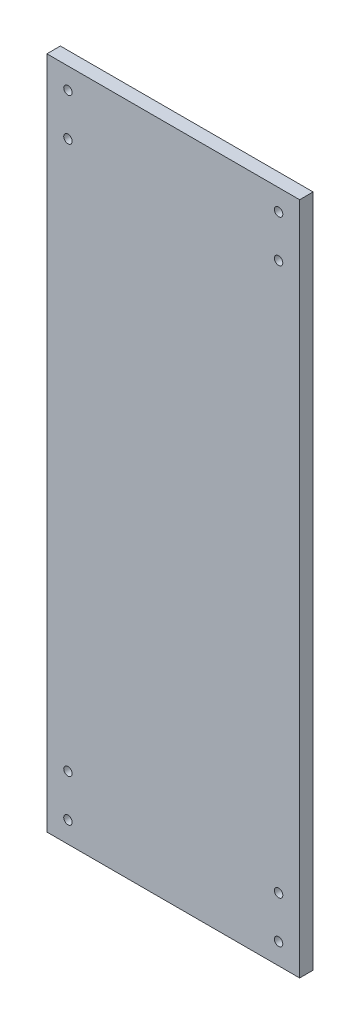
ISO-10303-21;
HEADER;
FILE_DESCRIPTION(('STEP AP214'),'2;1');
FILE_NAME('part.step','',(''),(''),'','','');
FILE_SCHEMA(('AUTOMOTIVE_DESIGN { 1 0 10303 214 1 1 1 1 }'));
ENDSEC;
DATA;
#1=APPLICATION_CONTEXT('core data for automotive mechanical design processes');
#2=APPLICATION_PROTOCOL_DEFINITION('international standard','automotive_design',2000,#1);
#3=PRODUCT_CONTEXT('',#1,'mechanical');
#4=PRODUCT('Part','Part','',(#3));
#5=PRODUCT_RELATED_PRODUCT_CATEGORY('part','',(#4));
#6=PRODUCT_DEFINITION_FORMATION('','',#4);
#7=PRODUCT_DEFINITION_CONTEXT('part definition',#1,'design');
#8=PRODUCT_DEFINITION('design','',#6,#7);
#9=PRODUCT_DEFINITION_SHAPE('','',#8);
#10=(LENGTH_UNIT() NAMED_UNIT(*) SI_UNIT(.MILLI.,.METRE.));
#11=(NAMED_UNIT(*) PLANE_ANGLE_UNIT() SI_UNIT($,.RADIAN.));
#12=(NAMED_UNIT(*) SI_UNIT($,.STERADIAN.) SOLID_ANGLE_UNIT());
#13=UNCERTAINTY_MEASURE_WITH_UNIT(LENGTH_MEASURE(1.E-05),#10,'distance_accuracy_value','');
#14=(GEOMETRIC_REPRESENTATION_CONTEXT(3) GLOBAL_UNCERTAINTY_ASSIGNED_CONTEXT((#13)) GLOBAL_UNIT_ASSIGNED_CONTEXT((#10,
#11,#12)) REPRESENTATION_CONTEXT('',''));
#15=CARTESIAN_POINT('',(0.,0.,0.));
#16=DIRECTION('',(0.,0.,1.));
#17=DIRECTION('',(1.,0.,0.));
#18=AXIS2_PLACEMENT_3D('',#15,#16,#17);
#19=CARTESIAN_POINT('',(0.,0.,1.6));
#20=DIRECTION('',(0.,0.,-1.));
#21=DIRECTION('',(-1.,0.,0.));
#22=AXIS2_PLACEMENT_3D('',#19,#20,#21);
#23=PLANE('',#22);
#24=DIRECTION('',(0.,1.,0.));
#25=VECTOR('',#24,1.);
#26=CARTESIAN_POINT('',(142.096158615373,78.9999996110874,1.6));
#27=LINE('',#26,#25);
#28=CARTESIAN_POINT('',(142.096158615373,-1.00000038891262,1.6));
#29=VERTEX_POINT('',#28);
#30=CARTESIAN_POINT('',(142.096158615373,78.9999996110874,1.6));
#31=VERTEX_POINT('',#30);
#32=EDGE_CURVE('E86',#29,#31,#27,.T.);
#33=ORIENTED_EDGE('',*,*,#32,.T.);
#34=DIRECTION('',(-1.,0.,0.));
#35=VECTOR('',#34,1.);
#36=CARTESIAN_POINT('',(112.096158615373,78.9999996110874,1.6));
#37=LINE('',#36,#35);
#38=CARTESIAN_POINT('',(112.096158615373,78.9999996110874,1.6));
#39=VERTEX_POINT('',#38);
#40=EDGE_CURVE('E81',#31,#39,#37,.T.);
#41=ORIENTED_EDGE('',*,*,#40,.T.);
#42=DIRECTION('',(0.,-1.,0.));
#43=VECTOR('',#42,1.);
#44=CARTESIAN_POINT('',(112.096158615373,-1.00000038891261,1.6));
#45=LINE('',#44,#43);
#46=CARTESIAN_POINT('',(112.096158615373,-1.00000038891261,1.6));
#47=VERTEX_POINT('',#46);
#48=EDGE_CURVE('E84',#39,#47,#45,.T.);
#49=ORIENTED_EDGE('',*,*,#48,.T.);
#50=DIRECTION('',(1.,0.,0.));
#51=VECTOR('',#50,1.);
#52=CARTESIAN_POINT('',(142.096158615373,-1.00000038891262,1.6));
#53=LINE('',#52,#51);
#54=EDGE_CURVE('E51',#47,#29,#53,.T.);
#55=ORIENTED_EDGE('',*,*,#54,.T.);
#56=EDGE_LOOP('',(#33,#41,#49,#55));
#57=FACE_BOUND('',#56,.T.);
#58=CARTESIAN_POINT('',(114.596158615373,6.49999961108738,1.6));
#59=DIRECTION('',(0.,0.,1.));
#60=DIRECTION('',(1.,0.,0.));
#61=AXIS2_PLACEMENT_3D('',#58,#59,#60);
#62=CIRCLE('',#61,0.5);
#63=CARTESIAN_POINT('',(115.096158615373,6.49999961108738,1.6));
#64=VERTEX_POINT('',#63);
#65=EDGE_CURVE('E101',#64,#64,#62,.T.);
#66=ORIENTED_EDGE('',*,*,#65,.F.);
#67=EDGE_LOOP('',(#66));
#68=FACE_BOUND('',#67,.T.);
#69=CARTESIAN_POINT('',(114.596158615373,71.4999996110874,1.6));
#70=DIRECTION('',(0.,0.,1.));
#71=DIRECTION('',(1.,0.,0.));
#72=AXIS2_PLACEMENT_3D('',#69,#70,#71);
#73=CIRCLE('',#72,0.5);
#74=CARTESIAN_POINT('',(115.096158615373,71.4999996110874,1.6));
#75=VERTEX_POINT('',#74);
#76=EDGE_CURVE('E116',#75,#75,#73,.T.);
#77=ORIENTED_EDGE('',*,*,#76,.F.);
#78=EDGE_LOOP('',(#77));
#79=FACE_BOUND('',#78,.T.);
#80=CARTESIAN_POINT('',(139.596158615373,6.49999961108738,1.6));
#81=DIRECTION('',(0.,0.,1.));
#82=DIRECTION('',(1.,0.,0.));
#83=AXIS2_PLACEMENT_3D('',#80,#81,#82);
#84=CIRCLE('',#83,0.5);
#85=CARTESIAN_POINT('',(140.096158615373,6.49999961108738,1.6));
#86=VERTEX_POINT('',#85);
#87=EDGE_CURVE('E122',#86,#86,#84,.T.);
#88=ORIENTED_EDGE('',*,*,#87,.F.);
#89=EDGE_LOOP('',(#88));
#90=FACE_BOUND('',#89,.T.);
#91=CARTESIAN_POINT('',(139.596158615373,71.4999996110874,1.6));
#92=DIRECTION('',(0.,0.,1.));
#93=DIRECTION('',(1.,0.,0.));
#94=AXIS2_PLACEMENT_3D('',#91,#92,#93);
#95=CIRCLE('',#94,0.5);
#96=CARTESIAN_POINT('',(140.096158615373,71.4999996110874,1.6));
#97=VERTEX_POINT('',#96);
#98=EDGE_CURVE('E128',#97,#97,#95,.T.);
#99=ORIENTED_EDGE('',*,*,#98,.F.);
#100=EDGE_LOOP('',(#99));
#101=FACE_BOUND('',#100,.T.);
#102=CARTESIAN_POINT('',(114.596158615373,76.4999996110874,1.6));
#103=DIRECTION('',(0.,0.,1.));
#104=DIRECTION('',(1.,0.,0.));
#105=AXIS2_PLACEMENT_3D('',#102,#103,#104);
#106=CIRCLE('',#105,0.5);
#107=CARTESIAN_POINT('',(115.096158615373,76.4999996110874,1.6));
#108=VERTEX_POINT('',#107);
#109=EDGE_CURVE('E134',#108,#108,#106,.T.);
#110=ORIENTED_EDGE('',*,*,#109,.F.);
#111=EDGE_LOOP('',(#110));
#112=FACE_BOUND('',#111,.T.);
#113=CARTESIAN_POINT('',(139.596158615373,76.4999996110874,1.6));
#114=DIRECTION('',(0.,0.,1.));
#115=DIRECTION('',(1.,0.,0.));
#116=AXIS2_PLACEMENT_3D('',#113,#114,#115);
#117=CIRCLE('',#116,0.5);
#118=CARTESIAN_POINT('',(140.096158615373,76.4999996110874,1.6));
#119=VERTEX_POINT('',#118);
#120=EDGE_CURVE('E140',#119,#119,#117,.T.);
#121=ORIENTED_EDGE('',*,*,#120,.F.);
#122=EDGE_LOOP('',(#121));
#123=FACE_BOUND('',#122,.T.);
#124=CARTESIAN_POINT('',(114.596158615373,1.49999961108738,1.6));
#125=DIRECTION('',(0.,0.,1.));
#126=DIRECTION('',(1.,0.,0.));
#127=AXIS2_PLACEMENT_3D('',#124,#125,#126);
#128=CIRCLE('',#127,0.5);
#129=CARTESIAN_POINT('',(115.096158615373,1.49999961108738,1.6));
#130=VERTEX_POINT('',#129);
#131=EDGE_CURVE('E146',#130,#130,#128,.T.);
#132=ORIENTED_EDGE('',*,*,#131,.F.);
#133=EDGE_LOOP('',(#132));
#134=FACE_BOUND('',#133,.T.);
#135=CARTESIAN_POINT('',(139.596158615373,1.49999961108738,1.6));
#136=DIRECTION('',(0.,0.,1.));
#137=DIRECTION('',(1.,0.,0.));
#138=AXIS2_PLACEMENT_3D('',#135,#136,#137);
#139=CIRCLE('',#138,0.5);
#140=CARTESIAN_POINT('',(140.096158615373,1.49999961108738,1.6));
#141=VERTEX_POINT('',#140);
#142=EDGE_CURVE('E152',#141,#141,#139,.T.);
#143=ORIENTED_EDGE('',*,*,#142,.F.);
#144=EDGE_LOOP('',(#143));
#145=FACE_BOUND('',#144,.T.);
#146=ADVANCED_FACE('F34',(#57,#68,#79,#90,#101,#112,#123,#134,#145),#23,.F.);
#147=CARTESIAN_POINT('',(0.,0.,0.));
#148=DIRECTION('',(0.,0.,-1.));
#149=DIRECTION('',(-1.,0.,0.));
#150=AXIS2_PLACEMENT_3D('',#147,#148,#149);
#151=PLANE('',#150);
#152=CARTESIAN_POINT('',(114.596158615373,1.49999961108738,0.));
#153=DIRECTION('',(0.,0.,1.));
#154=DIRECTION('',(1.,0.,0.));
#155=AXIS2_PLACEMENT_3D('',#152,#153,#154);
#156=CIRCLE('',#155,0.5);
#157=CARTESIAN_POINT('',(115.096158615373,1.49999961108738,0.));
#158=VERTEX_POINT('',#157);
#159=EDGE_CURVE('E149',#158,#158,#156,.T.);
#160=ORIENTED_EDGE('',*,*,#159,.T.);
#161=EDGE_LOOP('',(#160));
#162=FACE_BOUND('',#161,.T.);
#163=CARTESIAN_POINT('',(114.596158615373,76.4999996110874,0.));
#164=DIRECTION('',(0.,0.,1.));
#165=DIRECTION('',(1.,0.,0.));
#166=AXIS2_PLACEMENT_3D('',#163,#164,#165);
#167=CIRCLE('',#166,0.5);
#168=CARTESIAN_POINT('',(115.096158615373,76.4999996110874,0.));
#169=VERTEX_POINT('',#168);
#170=EDGE_CURVE('E137',#169,#169,#167,.T.);
#171=ORIENTED_EDGE('',*,*,#170,.T.);
#172=EDGE_LOOP('',(#171));
#173=FACE_BOUND('',#172,.T.);
#174=CARTESIAN_POINT('',(139.596158615373,6.49999961108738,0.));
#175=DIRECTION('',(0.,0.,1.));
#176=DIRECTION('',(1.,0.,0.));
#177=AXIS2_PLACEMENT_3D('',#174,#175,#176);
#178=CIRCLE('',#177,0.5);
#179=CARTESIAN_POINT('',(140.096158615373,6.49999961108738,0.));
#180=VERTEX_POINT('',#179);
#181=EDGE_CURVE('E125',#180,#180,#178,.T.);
#182=ORIENTED_EDGE('',*,*,#181,.T.);
#183=EDGE_LOOP('',(#182));
#184=FACE_BOUND('',#183,.T.);
#185=CARTESIAN_POINT('',(114.596158615373,6.49999961108738,0.));
#186=DIRECTION('',(0.,0.,1.));
#187=DIRECTION('',(1.,0.,0.));
#188=AXIS2_PLACEMENT_3D('',#185,#186,#187);
#189=CIRCLE('',#188,0.5);
#190=CARTESIAN_POINT('',(115.096158615373,6.49999961108738,0.));
#191=VERTEX_POINT('',#190);
#192=EDGE_CURVE('E113',#191,#191,#189,.T.);
#193=ORIENTED_EDGE('',*,*,#192,.T.);
#194=EDGE_LOOP('',(#193));
#195=FACE_BOUND('',#194,.T.);
#196=DIRECTION('',(0.,1.,0.));
#197=VECTOR('',#196,1.);
#198=CARTESIAN_POINT('',(142.096158615373,78.9999996110874,0.));
#199=LINE('',#198,#197);
#200=CARTESIAN_POINT('',(142.096158615373,-1.00000038891262,0.));
#201=VERTEX_POINT('',#200);
#202=CARTESIAN_POINT('',(142.096158615373,78.9999996110874,0.));
#203=VERTEX_POINT('',#202);
#204=EDGE_CURVE('E98',#201,#203,#199,.T.);
#205=ORIENTED_EDGE('',*,*,#204,.F.);
#206=DIRECTION('',(1.,0.,0.));
#207=VECTOR('',#206,1.);
#208=CARTESIAN_POINT('',(142.096158615373,-1.00000038891262,0.));
#209=LINE('',#208,#207);
#210=CARTESIAN_POINT('',(112.096158615373,-1.00000038891261,0.));
#211=VERTEX_POINT('',#210);
#212=EDGE_CURVE('E74',#211,#201,#209,.T.);
#213=ORIENTED_EDGE('',*,*,#212,.F.);
#214=DIRECTION('',(0.,-1.,0.));
#215=VECTOR('',#214,1.);
#216=CARTESIAN_POINT('',(112.096158615373,-1.00000038891261,0.));
#217=LINE('',#216,#215);
#218=CARTESIAN_POINT('',(112.096158615373,78.9999996110874,0.));
#219=VERTEX_POINT('',#218);
#220=EDGE_CURVE('E68',#219,#211,#217,.T.);
#221=ORIENTED_EDGE('',*,*,#220,.F.);
#222=DIRECTION('',(-1.,0.,0.));
#223=VECTOR('',#222,1.);
#224=CARTESIAN_POINT('',(112.096158615373,78.9999996110874,0.));
#225=LINE('',#224,#223);
#226=EDGE_CURVE('E90',#203,#219,#225,.T.);
#227=ORIENTED_EDGE('',*,*,#226,.F.);
#228=EDGE_LOOP('',(#205,#213,#221,#227));
#229=FACE_BOUND('',#228,.T.);
#230=CARTESIAN_POINT('',(114.596158615373,71.4999996110874,0.));
#231=DIRECTION('',(0.,0.,1.));
#232=DIRECTION('',(1.,0.,0.));
#233=AXIS2_PLACEMENT_3D('',#230,#231,#232);
#234=CIRCLE('',#233,0.5);
#235=CARTESIAN_POINT('',(115.096158615373,71.4999996110874,0.));
#236=VERTEX_POINT('',#235);
#237=EDGE_CURVE('E119',#236,#236,#234,.T.);
#238=ORIENTED_EDGE('',*,*,#237,.T.);
#239=EDGE_LOOP('',(#238));
#240=FACE_BOUND('',#239,.T.);
#241=CARTESIAN_POINT('',(139.596158615373,71.4999996110874,0.));
#242=DIRECTION('',(0.,0.,1.));
#243=DIRECTION('',(1.,0.,0.));
#244=AXIS2_PLACEMENT_3D('',#241,#242,#243);
#245=CIRCLE('',#244,0.5);
#246=CARTESIAN_POINT('',(140.096158615373,71.4999996110874,0.));
#247=VERTEX_POINT('',#246);
#248=EDGE_CURVE('E131',#247,#247,#245,.T.);
#249=ORIENTED_EDGE('',*,*,#248,.T.);
#250=EDGE_LOOP('',(#249));
#251=FACE_BOUND('',#250,.T.);
#252=CARTESIAN_POINT('',(139.596158615373,76.4999996110874,0.));
#253=DIRECTION('',(0.,0.,1.));
#254=DIRECTION('',(1.,0.,0.));
#255=AXIS2_PLACEMENT_3D('',#252,#253,#254);
#256=CIRCLE('',#255,0.5);
#257=CARTESIAN_POINT('',(140.096158615373,76.4999996110874,0.));
#258=VERTEX_POINT('',#257);
#259=EDGE_CURVE('E143',#258,#258,#256,.T.);
#260=ORIENTED_EDGE('',*,*,#259,.T.);
#261=EDGE_LOOP('',(#260));
#262=FACE_BOUND('',#261,.T.);
#263=CARTESIAN_POINT('',(139.596158615373,1.49999961108738,0.));
#264=DIRECTION('',(0.,0.,1.));
#265=DIRECTION('',(1.,0.,0.));
#266=AXIS2_PLACEMENT_3D('',#263,#264,#265);
#267=CIRCLE('',#266,0.5);
#268=CARTESIAN_POINT('',(140.096158615373,1.49999961108738,0.));
#269=VERTEX_POINT('',#268);
#270=EDGE_CURVE('E155',#269,#269,#267,.T.);
#271=ORIENTED_EDGE('',*,*,#270,.T.);
#272=EDGE_LOOP('',(#271));
#273=FACE_BOUND('',#272,.T.);
#274=ADVANCED_FACE('F109',(#162,#173,#184,#195,#229,#240,#251,#262,#273),#151,.T.);
#275=CARTESIAN_POINT('',(142.096158615373,78.9999996110874,1.6));
#276=DIRECTION('',(-1.,0.,0.));
#277=DIRECTION('',(0.,-1.,0.));
#278=AXIS2_PLACEMENT_3D('',#275,#276,#277);
#279=PLANE('',#278);
#280=ORIENTED_EDGE('',*,*,#204,.T.);
#281=DIRECTION('',(0.,0.,-1.));
#282=VECTOR('',#281,1.);
#283=CARTESIAN_POINT('',(142.096158615373,78.9999996110874,1.6));
#284=LINE('',#283,#282);
#285=EDGE_CURVE('E11',#31,#203,#284,.T.);
#286=ORIENTED_EDGE('',*,*,#285,.F.);
#287=ORIENTED_EDGE('',*,*,#32,.F.);
#288=DIRECTION('',(0.,0.,-1.));
#289=VECTOR('',#288,1.);
#290=CARTESIAN_POINT('',(142.096158615373,-1.00000038891262,1.6));
#291=LINE('',#290,#289);
#292=EDGE_CURVE('E94',#29,#201,#291,.T.);
#293=ORIENTED_EDGE('',*,*,#292,.T.);
#294=EDGE_LOOP('',(#280,#286,#287,#293));
#295=FACE_BOUND('',#294,.T.);
#296=ADVANCED_FACE('F36',(#295),#279,.F.);
#297=CARTESIAN_POINT('',(112.096158615373,78.9999996110874,1.6));
#298=DIRECTION('',(0.,-1.,0.));
#299=DIRECTION('',(0.,0.,-1.));
#300=AXIS2_PLACEMENT_3D('',#297,#298,#299);
#301=PLANE('',#300);
#302=ORIENTED_EDGE('',*,*,#226,.T.);
#303=DIRECTION('',(0.,0.,-1.));
#304=VECTOR('',#303,1.);
#305=CARTESIAN_POINT('',(112.096158615373,78.9999996110874,1.6));
#306=LINE('',#305,#304);
#307=EDGE_CURVE('E43',#39,#219,#306,.T.);
#308=ORIENTED_EDGE('',*,*,#307,.F.);
#309=ORIENTED_EDGE('',*,*,#40,.F.);
#310=ORIENTED_EDGE('',*,*,#285,.T.);
#311=EDGE_LOOP('',(#302,#308,#309,#310));
#312=FACE_BOUND('',#311,.T.);
#313=ADVANCED_FACE('F89',(#312),#301,.F.);
#314=CARTESIAN_POINT('',(112.096158615373,-1.00000038891261,1.6));
#315=DIRECTION('',(1.,0.,0.));
#316=DIRECTION('',(0.,1.,0.));
#317=AXIS2_PLACEMENT_3D('',#314,#315,#316);
#318=PLANE('',#317);
#319=ORIENTED_EDGE('',*,*,#220,.T.);
#320=DIRECTION('',(0.,0.,-1.));
#321=VECTOR('',#320,1.);
#322=CARTESIAN_POINT('',(112.096158615373,-1.00000038891261,1.6));
#323=LINE('',#322,#321);
#324=EDGE_CURVE('E91',#47,#211,#323,.T.);
#325=ORIENTED_EDGE('',*,*,#324,.F.);
#326=ORIENTED_EDGE('',*,*,#48,.F.);
#327=ORIENTED_EDGE('',*,*,#307,.T.);
#328=EDGE_LOOP('',(#319,#325,#326,#327));
#329=FACE_BOUND('',#328,.T.);
#330=ADVANCED_FACE('F92',(#329),#318,.F.);
#331=CARTESIAN_POINT('',(142.096158615373,-1.00000038891262,1.6));
#332=DIRECTION('',(0.,1.,0.));
#333=DIRECTION('',(-1.,0.,0.));
#334=AXIS2_PLACEMENT_3D('',#331,#332,#333);
#335=PLANE('',#334);
#336=ORIENTED_EDGE('',*,*,#212,.T.);
#337=ORIENTED_EDGE('',*,*,#292,.F.);
#338=ORIENTED_EDGE('',*,*,#54,.F.);
#339=ORIENTED_EDGE('',*,*,#324,.T.);
#340=EDGE_LOOP('',(#336,#337,#338,#339));
#341=FACE_BOUND('',#340,.T.);
#342=ADVANCED_FACE('F106',(#341),#335,.F.);
#343=CARTESIAN_POINT('',(114.596158615373,6.49999961108738,1.6));
#344=DIRECTION('',(0.,0.,-1.));
#345=DIRECTION('',(-1.,0.,0.));
#346=AXIS2_PLACEMENT_3D('',#343,#344,#345);
#347=CYLINDRICAL_SURFACE('',#346,0.5);
#348=ORIENTED_EDGE('',*,*,#65,.T.);
#349=EDGE_LOOP('',(#348));
#350=FACE_BOUND('',#349,.T.);
#351=ORIENTED_EDGE('',*,*,#192,.F.);
#352=EDGE_LOOP('',(#351));
#353=FACE_BOUND('',#352,.T.);
#354=ADVANCED_FACE('F172',(#350,#353),#347,.F.);
#355=CARTESIAN_POINT('',(114.596158615373,71.4999996110874,1.6));
#356=DIRECTION('',(0.,0.,-1.));
#357=DIRECTION('',(-1.,0.,0.));
#358=AXIS2_PLACEMENT_3D('',#355,#356,#357);
#359=CYLINDRICAL_SURFACE('',#358,0.5);
#360=ORIENTED_EDGE('',*,*,#76,.T.);
#361=EDGE_LOOP('',(#360));
#362=FACE_BOUND('',#361,.T.);
#363=ORIENTED_EDGE('',*,*,#237,.F.);
#364=EDGE_LOOP('',(#363));
#365=FACE_BOUND('',#364,.T.);
#366=ADVANCED_FACE('F218',(#362,#365),#359,.F.);
#367=CARTESIAN_POINT('',(139.596158615373,6.49999961108738,1.6));
#368=DIRECTION('',(0.,0.,-1.));
#369=DIRECTION('',(-1.,0.,0.));
#370=AXIS2_PLACEMENT_3D('',#367,#368,#369);
#371=CYLINDRICAL_SURFACE('',#370,0.5);
#372=ORIENTED_EDGE('',*,*,#87,.T.);
#373=EDGE_LOOP('',(#372));
#374=FACE_BOUND('',#373,.T.);
#375=ORIENTED_EDGE('',*,*,#181,.F.);
#376=EDGE_LOOP('',(#375));
#377=FACE_BOUND('',#376,.T.);
#378=ADVANCED_FACE('F226',(#374,#377),#371,.F.);
#379=CARTESIAN_POINT('',(139.596158615373,71.4999996110874,1.6));
#380=DIRECTION('',(0.,0.,-1.));
#381=DIRECTION('',(-1.,0.,0.));
#382=AXIS2_PLACEMENT_3D('',#379,#380,#381);
#383=CYLINDRICAL_SURFACE('',#382,0.5);
#384=ORIENTED_EDGE('',*,*,#98,.T.);
#385=EDGE_LOOP('',(#384));
#386=FACE_BOUND('',#385,.T.);
#387=ORIENTED_EDGE('',*,*,#248,.F.);
#388=EDGE_LOOP('',(#387));
#389=FACE_BOUND('',#388,.T.);
#390=ADVANCED_FACE('F234',(#386,#389),#383,.F.);
#391=CARTESIAN_POINT('',(114.596158615373,76.4999996110874,1.6));
#392=DIRECTION('',(0.,0.,-1.));
#393=DIRECTION('',(-1.,0.,0.));
#394=AXIS2_PLACEMENT_3D('',#391,#392,#393);
#395=CYLINDRICAL_SURFACE('',#394,0.5);
#396=ORIENTED_EDGE('',*,*,#109,.T.);
#397=EDGE_LOOP('',(#396));
#398=FACE_BOUND('',#397,.T.);
#399=ORIENTED_EDGE('',*,*,#170,.F.);
#400=EDGE_LOOP('',(#399));
#401=FACE_BOUND('',#400,.T.);
#402=ADVANCED_FACE('F243',(#398,#401),#395,.F.);
#403=CARTESIAN_POINT('',(139.596158615373,76.4999996110874,1.6));
#404=DIRECTION('',(0.,0.,-1.));
#405=DIRECTION('',(-1.,0.,0.));
#406=AXIS2_PLACEMENT_3D('',#403,#404,#405);
#407=CYLINDRICAL_SURFACE('',#406,0.5);
#408=ORIENTED_EDGE('',*,*,#120,.T.);
#409=EDGE_LOOP('',(#408));
#410=FACE_BOUND('',#409,.T.);
#411=ORIENTED_EDGE('',*,*,#259,.F.);
#412=EDGE_LOOP('',(#411));
#413=FACE_BOUND('',#412,.T.);
#414=ADVANCED_FACE('F252',(#410,#413),#407,.F.);
#415=CARTESIAN_POINT('',(114.596158615373,1.49999961108738,1.6));
#416=DIRECTION('',(0.,0.,-1.));
#417=DIRECTION('',(-1.,0.,0.));
#418=AXIS2_PLACEMENT_3D('',#415,#416,#417);
#419=CYLINDRICAL_SURFACE('',#418,0.5);
#420=ORIENTED_EDGE('',*,*,#131,.T.);
#421=EDGE_LOOP('',(#420));
#422=FACE_BOUND('',#421,.T.);
#423=ORIENTED_EDGE('',*,*,#159,.F.);
#424=EDGE_LOOP('',(#423));
#425=FACE_BOUND('',#424,.T.);
#426=ADVANCED_FACE('F261',(#422,#425),#419,.F.);
#427=CARTESIAN_POINT('',(139.596158615373,1.49999961108738,1.6));
#428=DIRECTION('',(0.,0.,-1.));
#429=DIRECTION('',(-1.,0.,0.));
#430=AXIS2_PLACEMENT_3D('',#427,#428,#429);
#431=CYLINDRICAL_SURFACE('',#430,0.5);
#432=ORIENTED_EDGE('',*,*,#142,.T.);
#433=EDGE_LOOP('',(#432));
#434=FACE_BOUND('',#433,.T.);
#435=ORIENTED_EDGE('',*,*,#270,.F.);
#436=EDGE_LOOP('',(#435));
#437=FACE_BOUND('',#436,.T.);
#438=ADVANCED_FACE('F161',(#434,#437),#431,.F.);
#439=CLOSED_SHELL('',(#146,#274,#296,#313,#330,#342,#354,#366,#378,#390,#402,#414,#426,#438));
#440=MANIFOLD_SOLID_BREP('B2',#439);
#441=ADVANCED_BREP_SHAPE_REPRESENTATION('',(#18,#440),#14);
#442=SHAPE_DEFINITION_REPRESENTATION(#9,#441);
ENDSEC;
END-ISO-10303-21;
